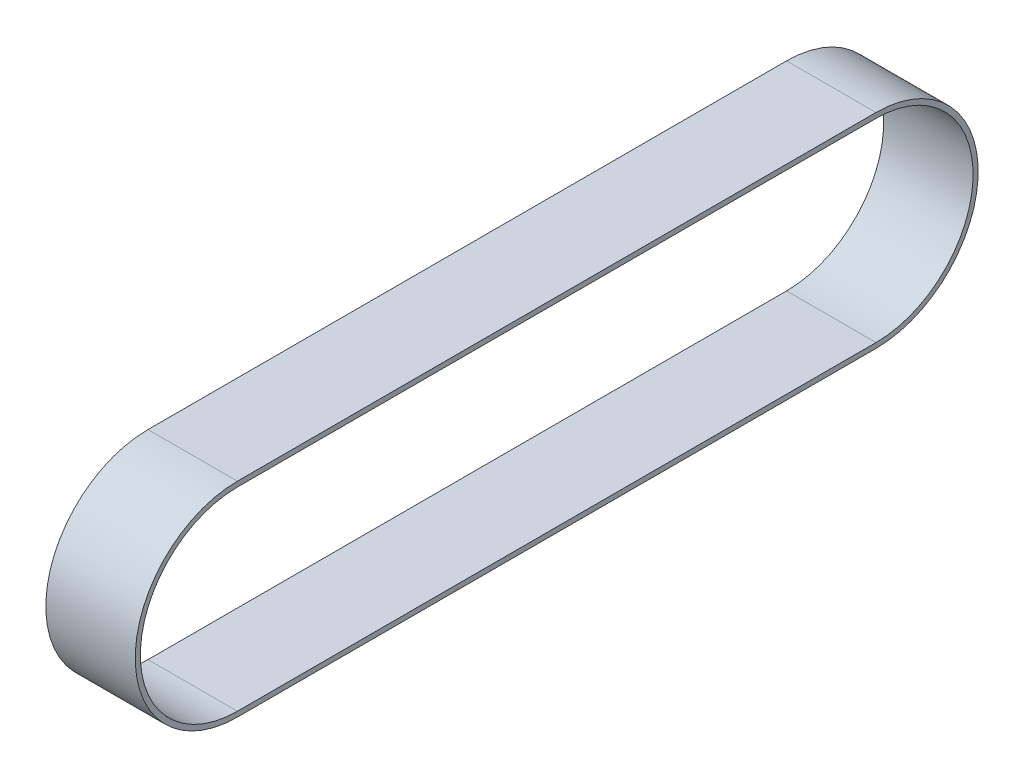
ISO-10303-21;
HEADER;
FILE_DESCRIPTION(('STEP AP214'),'2;1');
FILE_NAME('part.step','',(''),(''),'','','');
FILE_SCHEMA(('AUTOMOTIVE_DESIGN { 1 0 10303 214 1 1 1 1 }'));
ENDSEC;
DATA;
#1=APPLICATION_CONTEXT('core data for automotive mechanical design processes');
#2=APPLICATION_PROTOCOL_DEFINITION('international standard','automotive_design',2000,#1);
#3=PRODUCT_CONTEXT('',#1,'mechanical');
#4=PRODUCT('Part','Part','',(#3));
#5=PRODUCT_RELATED_PRODUCT_CATEGORY('part','',(#4));
#6=PRODUCT_DEFINITION_FORMATION('','',#4);
#7=PRODUCT_DEFINITION_CONTEXT('part definition',#1,'design');
#8=PRODUCT_DEFINITION('design','',#6,#7);
#9=PRODUCT_DEFINITION_SHAPE('','',#8);
#10=(LENGTH_UNIT() NAMED_UNIT(*) SI_UNIT(.MILLI.,.METRE.));
#11=(NAMED_UNIT(*) PLANE_ANGLE_UNIT() SI_UNIT($,.RADIAN.));
#12=(NAMED_UNIT(*) SI_UNIT($,.STERADIAN.) SOLID_ANGLE_UNIT());
#13=UNCERTAINTY_MEASURE_WITH_UNIT(LENGTH_MEASURE(1.E-05),#10,'distance_accuracy_value','');
#14=(GEOMETRIC_REPRESENTATION_CONTEXT(3) GLOBAL_UNCERTAINTY_ASSIGNED_CONTEXT((#13)) GLOBAL_UNIT_ASSIGNED_CONTEXT((#10,
#11,#12)) REPRESENTATION_CONTEXT('',''));
#15=CARTESIAN_POINT('',(0.,0.,0.));
#16=DIRECTION('',(0.,0.,1.));
#17=DIRECTION('',(1.,0.,0.));
#18=AXIS2_PLACEMENT_3D('',#15,#16,#17);
#19=CARTESIAN_POINT('',(35.,0.,0.));
#20=DIRECTION('',(1.,0.,0.));
#21=DIRECTION('',(0.,0.,-1.));
#22=AXIS2_PLACEMENT_3D('',#19,#20,#21);
#23=PLANE('',#22);
#24=CARTESIAN_POINT('',(35.,0.,0.));
#25=DIRECTION('',(1.,0.,0.));
#26=DIRECTION('',(0.,0.,-1.));
#27=AXIS2_PLACEMENT_3D('',#24,#25,#26);
#28=CIRCLE('',#27,40.);
#29=CARTESIAN_POINT('',(35.,-40.,0.));
#30=VERTEX_POINT('',#29);
#31=CARTESIAN_POINT('',(35.,40.,0.));
#32=VERTEX_POINT('',#31);
#33=EDGE_CURVE('E134',#30,#32,#28,.T.);
#34=ORIENTED_EDGE('',*,*,#33,.T.);
#35=DIRECTION('',(0.,0.,1.));
#36=VECTOR('',#35,1.);
#37=CARTESIAN_POINT('',(35.,40.,0.));
#38=LINE('',#37,#36);
#39=CARTESIAN_POINT('',(35.,40.,250.));
#40=VERTEX_POINT('',#39);
#41=EDGE_CURVE('E137',#32,#40,#38,.T.);
#42=ORIENTED_EDGE('',*,*,#41,.T.);
#43=CARTESIAN_POINT('',(35.,0.,250.));
#44=DIRECTION('',(1.,0.,0.));
#45=DIRECTION('',(0.,0.,-1.));
#46=AXIS2_PLACEMENT_3D('',#43,#44,#45);
#47=CIRCLE('',#46,40.);
#48=CARTESIAN_POINT('',(35.,-40.,250.));
#49=VERTEX_POINT('',#48);
#50=EDGE_CURVE('E140',#40,#49,#47,.T.);
#51=ORIENTED_EDGE('',*,*,#50,.T.);
#52=DIRECTION('',(0.,0.,-1.));
#53=VECTOR('',#52,1.);
#54=CARTESIAN_POINT('',(35.,-40.,0.));
#55=LINE('',#54,#53);
#56=EDGE_CURVE('E142',#49,#30,#55,.T.);
#57=ORIENTED_EDGE('',*,*,#56,.T.);
#58=EDGE_LOOP('',(#34,#42,#51,#57));
#59=FACE_BOUND('',#58,.T.);
#60=DIRECTION('',(0.,0.,1.));
#61=VECTOR('',#60,1.);
#62=CARTESIAN_POINT('',(35.,38.,0.));
#63=LINE('',#62,#61);
#64=CARTESIAN_POINT('',(35.,38.,0.));
#65=VERTEX_POINT('',#64);
#66=CARTESIAN_POINT('',(35.,38.,250.));
#67=VERTEX_POINT('',#66);
#68=EDGE_CURVE('E106',#65,#67,#63,.T.);
#69=ORIENTED_EDGE('',*,*,#68,.F.);
#70=CARTESIAN_POINT('',(35.,0.,0.));
#71=DIRECTION('',(1.,0.,0.));
#72=DIRECTION('',(0.,0.,-1.));
#73=AXIS2_PLACEMENT_3D('',#70,#71,#72);
#74=CIRCLE('',#73,38.);
#75=CARTESIAN_POINT('',(35.,-38.,0.));
#76=VERTEX_POINT('',#75);
#77=EDGE_CURVE('E98',#76,#65,#74,.T.);
#78=ORIENTED_EDGE('',*,*,#77,.F.);
#79=DIRECTION('',(0.,0.,-1.));
#80=VECTOR('',#79,1.);
#81=CARTESIAN_POINT('',(35.,-38.,0.));
#82=LINE('',#81,#80);
#83=CARTESIAN_POINT('',(35.,-38.,250.));
#84=VERTEX_POINT('',#83);
#85=EDGE_CURVE('E120',#84,#76,#82,.T.);
#86=ORIENTED_EDGE('',*,*,#85,.F.);
#87=CARTESIAN_POINT('',(35.,0.,250.));
#88=DIRECTION('',(1.,0.,0.));
#89=DIRECTION('',(0.,0.,-1.));
#90=AXIS2_PLACEMENT_3D('',#87,#88,#89);
#91=CIRCLE('',#90,38.);
#92=EDGE_CURVE('E118',#67,#84,#91,.T.);
#93=ORIENTED_EDGE('',*,*,#92,.F.);
#94=EDGE_LOOP('',(#69,#78,#86,#93));
#95=FACE_BOUND('',#94,.T.);
#96=ADVANCED_FACE('F33',(#59,#95),#23,.T.);
#97=CARTESIAN_POINT('',(0.,0.,0.));
#98=DIRECTION('',(1.,0.,0.));
#99=DIRECTION('',(0.,0.,-1.));
#100=AXIS2_PLACEMENT_3D('',#97,#98,#99);
#101=PLANE('',#100);
#102=CARTESIAN_POINT('',(0.,0.,0.));
#103=DIRECTION('',(1.,0.,0.));
#104=DIRECTION('',(0.,0.,-1.));
#105=AXIS2_PLACEMENT_3D('',#102,#103,#104);
#106=CIRCLE('',#105,40.);
#107=CARTESIAN_POINT('',(0.,-40.,0.));
#108=VERTEX_POINT('',#107);
#109=CARTESIAN_POINT('',(0.,40.,0.));
#110=VERTEX_POINT('',#109);
#111=EDGE_CURVE('E114',#108,#110,#106,.T.);
#112=ORIENTED_EDGE('',*,*,#111,.F.);
#113=DIRECTION('',(0.,0.,-1.));
#114=VECTOR('',#113,1.);
#115=CARTESIAN_POINT('',(0.,-40.,0.));
#116=LINE('',#115,#114);
#117=CARTESIAN_POINT('',(0.,-40.,250.));
#118=VERTEX_POINT('',#117);
#119=EDGE_CURVE('E138',#118,#108,#116,.T.);
#120=ORIENTED_EDGE('',*,*,#119,.F.);
#121=CARTESIAN_POINT('',(0.,0.,250.));
#122=DIRECTION('',(1.,0.,0.));
#123=DIRECTION('',(0.,0.,-1.));
#124=AXIS2_PLACEMENT_3D('',#121,#122,#123);
#125=CIRCLE('',#124,40.);
#126=CARTESIAN_POINT('',(0.,40.,250.));
#127=VERTEX_POINT('',#126);
#128=EDGE_CURVE('E149',#127,#118,#125,.T.);
#129=ORIENTED_EDGE('',*,*,#128,.F.);
#130=DIRECTION('',(0.,0.,1.));
#131=VECTOR('',#130,1.);
#132=CARTESIAN_POINT('',(0.,40.,0.));
#133=LINE('',#132,#131);
#134=EDGE_CURVE('E147',#110,#127,#133,.T.);
#135=ORIENTED_EDGE('',*,*,#134,.F.);
#136=EDGE_LOOP('',(#112,#120,#129,#135));
#137=FACE_BOUND('',#136,.T.);
#138=CARTESIAN_POINT('',(0.,0.,0.));
#139=DIRECTION('',(1.,0.,0.));
#140=DIRECTION('',(0.,0.,-1.));
#141=AXIS2_PLACEMENT_3D('',#138,#139,#140);
#142=CIRCLE('',#141,38.);
#143=CARTESIAN_POINT('',(0.,-38.,0.));
#144=VERTEX_POINT('',#143);
#145=CARTESIAN_POINT('',(0.,38.,0.));
#146=VERTEX_POINT('',#145);
#147=EDGE_CURVE('E56',#144,#146,#142,.T.);
#148=ORIENTED_EDGE('',*,*,#147,.T.);
#149=DIRECTION('',(0.,0.,1.));
#150=VECTOR('',#149,1.);
#151=CARTESIAN_POINT('',(0.,38.,0.));
#152=LINE('',#151,#150);
#153=CARTESIAN_POINT('',(0.,38.,250.));
#154=VERTEX_POINT('',#153);
#155=EDGE_CURVE('E113',#146,#154,#152,.T.);
#156=ORIENTED_EDGE('',*,*,#155,.T.);
#157=CARTESIAN_POINT('',(0.,0.,250.));
#158=DIRECTION('',(1.,0.,0.));
#159=DIRECTION('',(0.,0.,-1.));
#160=AXIS2_PLACEMENT_3D('',#157,#158,#159);
#161=CIRCLE('',#160,38.);
#162=CARTESIAN_POINT('',(0.,-38.,250.));
#163=VERTEX_POINT('',#162);
#164=EDGE_CURVE('E126',#154,#163,#161,.T.);
#165=ORIENTED_EDGE('',*,*,#164,.T.);
#166=DIRECTION('',(0.,0.,-1.));
#167=VECTOR('',#166,1.);
#168=CARTESIAN_POINT('',(0.,-38.,0.));
#169=LINE('',#168,#167);
#170=EDGE_CURVE('E107',#163,#144,#169,.T.);
#171=ORIENTED_EDGE('',*,*,#170,.T.);
#172=EDGE_LOOP('',(#148,#156,#165,#171));
#173=FACE_BOUND('',#172,.T.);
#174=ADVANCED_FACE('F167',(#137,#173),#101,.F.);
#175=CARTESIAN_POINT('',(35.,0.,0.));
#176=DIRECTION('',(-1.,0.,0.));
#177=DIRECTION('',(0.,0.,1.));
#178=AXIS2_PLACEMENT_3D('',#175,#176,#177);
#179=CYLINDRICAL_SURFACE('',#178,40.);
#180=ORIENTED_EDGE('',*,*,#111,.T.);
#181=DIRECTION('',(-1.,0.,0.));
#182=VECTOR('',#181,1.);
#183=CARTESIAN_POINT('',(35.,40.,0.));
#184=LINE('',#183,#182);
#185=EDGE_CURVE('E11',#32,#110,#184,.T.);
#186=ORIENTED_EDGE('',*,*,#185,.F.);
#187=ORIENTED_EDGE('',*,*,#33,.F.);
#188=DIRECTION('',(-1.,0.,0.));
#189=VECTOR('',#188,1.);
#190=CARTESIAN_POINT('',(35.,-40.,0.));
#191=LINE('',#190,#189);
#192=EDGE_CURVE('E144',#30,#108,#191,.T.);
#193=ORIENTED_EDGE('',*,*,#192,.T.);
#194=EDGE_LOOP('',(#180,#186,#187,#193));
#195=FACE_BOUND('',#194,.T.);
#196=ADVANCED_FACE('F35',(#195),#179,.T.);
#197=CARTESIAN_POINT('',(35.,40.,0.));
#198=DIRECTION('',(0.,-1.,0.));
#199=DIRECTION('',(0.,0.,-1.));
#200=AXIS2_PLACEMENT_3D('',#197,#198,#199);
#201=PLANE('',#200);
#202=ORIENTED_EDGE('',*,*,#134,.T.);
#203=DIRECTION('',(-1.,0.,0.));
#204=VECTOR('',#203,1.);
#205=CARTESIAN_POINT('',(35.,40.,250.));
#206=LINE('',#205,#204);
#207=EDGE_CURVE('E41',#40,#127,#206,.T.);
#208=ORIENTED_EDGE('',*,*,#207,.F.);
#209=ORIENTED_EDGE('',*,*,#41,.F.);
#210=ORIENTED_EDGE('',*,*,#185,.T.);
#211=EDGE_LOOP('',(#202,#208,#209,#210));
#212=FACE_BOUND('',#211,.T.);
#213=ADVANCED_FACE('F177',(#212),#201,.F.);
#214=CARTESIAN_POINT('',(35.,0.,250.));
#215=DIRECTION('',(-1.,0.,0.));
#216=DIRECTION('',(0.,0.,1.));
#217=AXIS2_PLACEMENT_3D('',#214,#215,#216);
#218=CYLINDRICAL_SURFACE('',#217,40.);
#219=ORIENTED_EDGE('',*,*,#128,.T.);
#220=DIRECTION('',(-1.,0.,0.));
#221=VECTOR('',#220,1.);
#222=CARTESIAN_POINT('',(35.,-40.,250.));
#223=LINE('',#222,#221);
#224=EDGE_CURVE('E154',#49,#118,#223,.T.);
#225=ORIENTED_EDGE('',*,*,#224,.F.);
#226=ORIENTED_EDGE('',*,*,#50,.F.);
#227=ORIENTED_EDGE('',*,*,#207,.T.);
#228=EDGE_LOOP('',(#219,#225,#226,#227));
#229=FACE_BOUND('',#228,.T.);
#230=ADVANCED_FACE('F161',(#229),#218,.T.);
#231=CARTESIAN_POINT('',(35.,-40.,0.));
#232=DIRECTION('',(0.,1.,0.));
#233=DIRECTION('',(0.,0.,1.));
#234=AXIS2_PLACEMENT_3D('',#231,#232,#233);
#235=PLANE('',#234);
#236=ORIENTED_EDGE('',*,*,#119,.T.);
#237=ORIENTED_EDGE('',*,*,#192,.F.);
#238=ORIENTED_EDGE('',*,*,#56,.F.);
#239=ORIENTED_EDGE('',*,*,#224,.T.);
#240=EDGE_LOOP('',(#236,#237,#238,#239));
#241=FACE_BOUND('',#240,.T.);
#242=ADVANCED_FACE('F171',(#241),#235,.F.);
#243=CARTESIAN_POINT('',(35.,0.,0.));
#244=DIRECTION('',(-1.,0.,0.));
#245=DIRECTION('',(0.,0.,1.));
#246=AXIS2_PLACEMENT_3D('',#243,#244,#245);
#247=CYLINDRICAL_SURFACE('',#246,38.);
#248=ORIENTED_EDGE('',*,*,#147,.F.);
#249=DIRECTION('',(-1.,0.,0.));
#250=VECTOR('',#249,1.);
#251=CARTESIAN_POINT('',(35.,-38.,0.));
#252=LINE('',#251,#250);
#253=EDGE_CURVE('E102',#76,#144,#252,.T.);
#254=ORIENTED_EDGE('',*,*,#253,.F.);
#255=ORIENTED_EDGE('',*,*,#77,.T.);
#256=DIRECTION('',(-1.,0.,0.));
#257=VECTOR('',#256,1.);
#258=CARTESIAN_POINT('',(35.,38.,0.));
#259=LINE('',#258,#257);
#260=EDGE_CURVE('E101',#65,#146,#259,.T.);
#261=ORIENTED_EDGE('',*,*,#260,.T.);
#262=EDGE_LOOP('',(#248,#254,#255,#261));
#263=FACE_BOUND('',#262,.T.);
#264=ADVANCED_FACE('F100',(#263),#247,.F.);
#265=CARTESIAN_POINT('',(35.,38.,0.));
#266=DIRECTION('',(0.,-1.,0.));
#267=DIRECTION('',(0.,0.,-1.));
#268=AXIS2_PLACEMENT_3D('',#265,#266,#267);
#269=PLANE('',#268);
#270=ORIENTED_EDGE('',*,*,#155,.F.);
#271=ORIENTED_EDGE('',*,*,#260,.F.);
#272=ORIENTED_EDGE('',*,*,#68,.T.);
#273=DIRECTION('',(-1.,0.,0.));
#274=VECTOR('',#273,1.);
#275=CARTESIAN_POINT('',(35.,38.,250.));
#276=LINE('',#275,#274);
#277=EDGE_CURVE('E115',#67,#154,#276,.T.);
#278=ORIENTED_EDGE('',*,*,#277,.T.);
#279=EDGE_LOOP('',(#270,#271,#272,#278));
#280=FACE_BOUND('',#279,.T.);
#281=ADVANCED_FACE('F110',(#280),#269,.T.);
#282=CARTESIAN_POINT('',(35.,0.,250.));
#283=DIRECTION('',(-1.,0.,0.));
#284=DIRECTION('',(0.,0.,1.));
#285=AXIS2_PLACEMENT_3D('',#282,#283,#284);
#286=CYLINDRICAL_SURFACE('',#285,38.);
#287=ORIENTED_EDGE('',*,*,#164,.F.);
#288=ORIENTED_EDGE('',*,*,#277,.F.);
#289=ORIENTED_EDGE('',*,*,#92,.T.);
#290=DIRECTION('',(-1.,0.,0.));
#291=VECTOR('',#290,1.);
#292=CARTESIAN_POINT('',(35.,-38.,250.));
#293=LINE('',#292,#291);
#294=EDGE_CURVE('E48',#84,#163,#293,.T.);
#295=ORIENTED_EDGE('',*,*,#294,.T.);
#296=EDGE_LOOP('',(#287,#288,#289,#295));
#297=FACE_BOUND('',#296,.T.);
#298=ADVANCED_FACE('F200',(#297),#286,.F.);
#299=CARTESIAN_POINT('',(35.,-38.,0.));
#300=DIRECTION('',(0.,1.,0.));
#301=DIRECTION('',(0.,0.,1.));
#302=AXIS2_PLACEMENT_3D('',#299,#300,#301);
#303=PLANE('',#302);
#304=ORIENTED_EDGE('',*,*,#170,.F.);
#305=ORIENTED_EDGE('',*,*,#294,.F.);
#306=ORIENTED_EDGE('',*,*,#85,.T.);
#307=ORIENTED_EDGE('',*,*,#253,.T.);
#308=EDGE_LOOP('',(#304,#305,#306,#307));
#309=FACE_BOUND('',#308,.T.);
#310=ADVANCED_FACE('F204',(#309),#303,.T.);
#311=CLOSED_SHELL('',(#96,#174,#196,#213,#230,#242,#264,#281,#298,#310));
#312=MANIFOLD_SOLID_BREP('B2',#311);
#313=ADVANCED_BREP_SHAPE_REPRESENTATION('',(#18,#312),#14);
#314=SHAPE_DEFINITION_REPRESENTATION(#9,#313);
ENDSEC;
END-ISO-10303-21;
